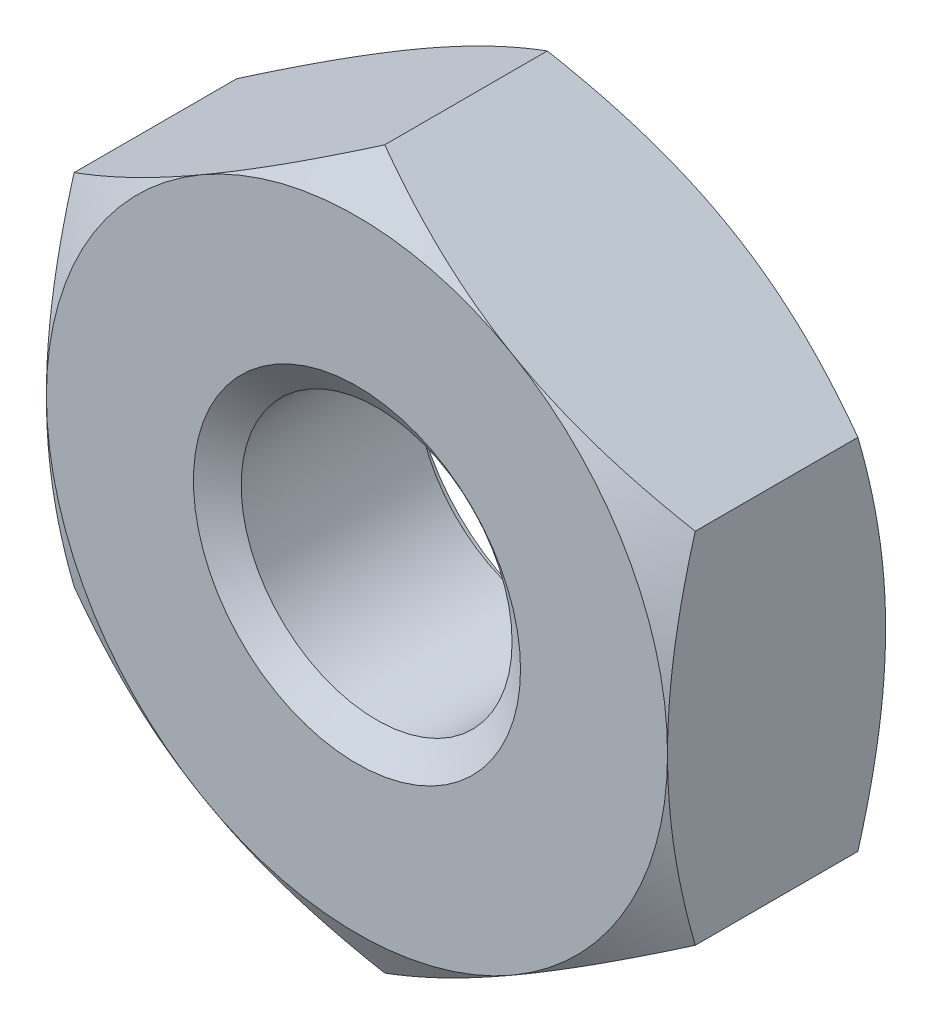
ISO-10303-21;
HEADER;
FILE_DESCRIPTION(('STEP AP214'),'2;1');
FILE_NAME('part.step','',(''),(''),'','','');
FILE_SCHEMA(('AUTOMOTIVE_DESIGN { 1 0 10303 214 1 1 1 1 }'));
ENDSEC;
DATA;
#1=APPLICATION_CONTEXT('core data for automotive mechanical design processes');
#2=APPLICATION_PROTOCOL_DEFINITION('international standard','automotive_design',2000,#1);
#3=PRODUCT_CONTEXT('',#1,'mechanical');
#4=PRODUCT('Part','Part','',(#3));
#5=PRODUCT_RELATED_PRODUCT_CATEGORY('part','',(#4));
#6=PRODUCT_DEFINITION_FORMATION('','',#4);
#7=PRODUCT_DEFINITION_CONTEXT('part definition',#1,'design');
#8=PRODUCT_DEFINITION('design','',#6,#7);
#9=PRODUCT_DEFINITION_SHAPE('','',#8);
#10=(LENGTH_UNIT() NAMED_UNIT(*) SI_UNIT(.MILLI.,.METRE.));
#11=(NAMED_UNIT(*) PLANE_ANGLE_UNIT() SI_UNIT($,.RADIAN.));
#12=(NAMED_UNIT(*) SI_UNIT($,.STERADIAN.) SOLID_ANGLE_UNIT());
#13=UNCERTAINTY_MEASURE_WITH_UNIT(LENGTH_MEASURE(1.E-05),#10,'distance_accuracy_value','');
#14=(GEOMETRIC_REPRESENTATION_CONTEXT(3) GLOBAL_UNCERTAINTY_ASSIGNED_CONTEXT((#13)) GLOBAL_UNIT_ASSIGNED_CONTEXT((#10,
#11,#12)) REPRESENTATION_CONTEXT('',''));
#15=CARTESIAN_POINT('',(0.,0.,0.));
#16=DIRECTION('',(0.,0.,1.));
#17=DIRECTION('',(1.,0.,0.));
#18=AXIS2_PLACEMENT_3D('',#15,#16,#17);
#19=CARTESIAN_POINT('',(0.,0.,-1.6764));
#20=DIRECTION('',(0.,0.,1.));
#21=DIRECTION('',(1.,0.,0.));
#22=AXIS2_PLACEMENT_3D('',#19,#20,#21);
#23=CYLINDRICAL_SURFACE('',#22,1.0414);
#24=CARTESIAN_POINT('',(0.,0.,-0.151174807499475));
#25=DIRECTION('',(0.,0.,1.));
#26=DIRECTION('',(1.,0.,0.));
#27=AXIS2_PLACEMENT_3D('',#24,#25,#26);
#28=CIRCLE('',#27,1.0414);
#29=CARTESIAN_POINT('',(1.0414,0.,-0.151174807499475));
#30=VERTEX_POINT('',#29);
#31=EDGE_CURVE('E174',#30,#30,#28,.F.);
#32=ORIENTED_EDGE('',*,*,#31,.F.);
#33=EDGE_LOOP('',(#32));
#34=FACE_BOUND('',#33,.T.);
#35=CARTESIAN_POINT('',(0.,0.,-1.49982519250052));
#36=DIRECTION('',(0.,0.,-1.));
#37=DIRECTION('',(-1.,0.,0.));
#38=AXIS2_PLACEMENT_3D('',#35,#36,#37);
#39=CIRCLE('',#38,1.0414);
#40=CARTESIAN_POINT('',(-1.0414,0.,-1.49982519250052));
#41=VERTEX_POINT('',#40);
#42=EDGE_CURVE('E39',#41,#41,#39,.F.);
#43=ORIENTED_EDGE('',*,*,#42,.F.);
#44=EDGE_LOOP('',(#43));
#45=FACE_BOUND('',#44,.T.);
#46=ADVANCED_FACE('F34',(#34,#45),#23,.F.);
#47=CARTESIAN_POINT('',(0.,2.7569630054343,-1.6764));
#48=DIRECTION('',(0.,0.,-1.));
#49=DIRECTION('',(-1.,0.,0.));
#50=AXIS2_PLACEMENT_3D('',#47,#48,#49);
#51=PLANE('',#50);
#52=CARTESIAN_POINT('',(0.,0.,-1.6764));
#53=DIRECTION('',(0.,0.,-1.));
#54=DIRECTION('',(-1.,0.,0.));
#55=AXIS2_PLACEMENT_3D('',#52,#53,#54);
#56=CIRCLE('',#55,2.3876);
#57=CARTESIAN_POINT('',(-2.3876,0.,-1.6764));
#58=VERTEX_POINT('',#57);
#59=CARTESIAN_POINT('',(-1.1938,-2.06772225407572,-1.6764));
#60=VERTEX_POINT('',#59);
#61=EDGE_CURVE('E170',#58,#60,#56,.F.);
#62=ORIENTED_EDGE('',*,*,#61,.F.);
#63=CARTESIAN_POINT('',(-1.1938,2.06772225407572,-1.6764));
#64=VERTEX_POINT('',#63);
#65=EDGE_CURVE('E152',#64,#58,#56,.F.);
#66=ORIENTED_EDGE('',*,*,#65,.F.);
#67=CARTESIAN_POINT('',(1.1938,2.06772225407572,-1.6764));
#68=VERTEX_POINT('',#67);
#69=EDGE_CURVE('E169',#68,#64,#56,.F.);
#70=ORIENTED_EDGE('',*,*,#69,.F.);
#71=CARTESIAN_POINT('',(0.,0.,-1.6764));
#72=DIRECTION('',(0.,0.,1.));
#73=DIRECTION('',(1.,0.,0.));
#74=AXIS2_PLACEMENT_3D('',#71,#72,#73);
#75=CIRCLE('',#74,2.3876);
#76=CARTESIAN_POINT('',(2.3876,0.,-1.6764));
#77=VERTEX_POINT('',#76);
#78=EDGE_CURVE('E244',#77,#68,#75,.T.);
#79=ORIENTED_EDGE('',*,*,#78,.F.);
#80=CARTESIAN_POINT('',(1.1938,-2.06772225407572,-1.6764));
#81=VERTEX_POINT('',#80);
#82=EDGE_CURVE('E360',#81,#77,#56,.F.);
#83=ORIENTED_EDGE('',*,*,#82,.F.);
#84=EDGE_CURVE('E364',#60,#81,#56,.F.);
#85=ORIENTED_EDGE('',*,*,#84,.F.);
#86=EDGE_LOOP('',(#62,#66,#70,#79,#83,#85));
#87=FACE_BOUND('',#86,.T.);
#88=CARTESIAN_POINT('',(0.,0.,-1.6764));
#89=DIRECTION('',(0.,0.,-1.));
#90=DIRECTION('',(-1.,0.,0.));
#91=AXIS2_PLACEMENT_3D('',#88,#89,#90);
#92=CIRCLE('',#91,1.2573);
#93=CARTESIAN_POINT('',(-1.2573,0.,-1.6764));
#94=VERTEX_POINT('',#93);
#95=EDGE_CURVE('E177',#94,#94,#92,.F.);
#96=ORIENTED_EDGE('',*,*,#95,.T.);
#97=EDGE_LOOP('',(#96));
#98=FACE_BOUND('',#97,.T.);
#99=ADVANCED_FACE('F297',(#87,#98),#51,.T.);
#100=CARTESIAN_POINT('',(0.,2.7569630054343,0.));
#101=DIRECTION('',(0.,0.,-1.));
#102=DIRECTION('',(-1.,0.,0.));
#103=AXIS2_PLACEMENT_3D('',#100,#101,#102);
#104=PLANE('',#103);
#105=CARTESIAN_POINT('',(0.,0.,0.));
#106=DIRECTION('',(0.,0.,-1.));
#107=DIRECTION('',(-1.,0.,0.));
#108=AXIS2_PLACEMENT_3D('',#105,#106,#107);
#109=CIRCLE('',#108,2.3876);
#110=CARTESIAN_POINT('',(-2.3876,0.,0.));
#111=VERTEX_POINT('',#110);
#112=CARTESIAN_POINT('',(-1.1938,2.06772225407572,0.));
#113=VERTEX_POINT('',#112);
#114=EDGE_CURVE('E11',#111,#113,#109,.T.);
#115=ORIENTED_EDGE('',*,*,#114,.F.);
#116=CARTESIAN_POINT('',(-1.1938,-2.06772225407572,0.));
#117=VERTEX_POINT('',#116);
#118=EDGE_CURVE('E46',#117,#111,#109,.T.);
#119=ORIENTED_EDGE('',*,*,#118,.F.);
#120=CARTESIAN_POINT('',(1.1938,-2.06772225407572,0.));
#121=VERTEX_POINT('',#120);
#122=EDGE_CURVE('E173',#121,#117,#109,.T.);
#123=ORIENTED_EDGE('',*,*,#122,.F.);
#124=CARTESIAN_POINT('',(2.3876,0.,0.));
#125=VERTEX_POINT('',#124);
#126=EDGE_CURVE('E351',#125,#121,#109,.T.);
#127=ORIENTED_EDGE('',*,*,#126,.F.);
#128=CARTESIAN_POINT('',(0.,0.,0.));
#129=DIRECTION('',(0.,0.,1.));
#130=DIRECTION('',(1.,0.,0.));
#131=AXIS2_PLACEMENT_3D('',#128,#129,#130);
#132=CIRCLE('',#131,2.3876);
#133=CARTESIAN_POINT('',(1.1938,2.06772225407572,0.));
#134=VERTEX_POINT('',#133);
#135=EDGE_CURVE('E128',#125,#134,#132,.T.);
#136=ORIENTED_EDGE('',*,*,#135,.T.);
#137=EDGE_CURVE('E44',#113,#134,#109,.T.);
#138=ORIENTED_EDGE('',*,*,#137,.F.);
#139=EDGE_LOOP('',(#115,#119,#123,#127,#136,#138));
#140=FACE_BOUND('',#139,.T.);
#141=CARTESIAN_POINT('',(0.,0.,0.));
#142=DIRECTION('',(0.,0.,1.));
#143=DIRECTION('',(1.,0.,0.));
#144=AXIS2_PLACEMENT_3D('',#141,#142,#143);
#145=CIRCLE('',#144,1.2573);
#146=CARTESIAN_POINT('',(1.2573,0.,0.));
#147=VERTEX_POINT('',#146);
#148=EDGE_CURVE('E176',#147,#147,#145,.T.);
#149=ORIENTED_EDGE('',*,*,#148,.F.);
#150=EDGE_LOOP('',(#149));
#151=FACE_BOUND('',#150,.T.);
#152=ADVANCED_FACE('F249',(#140,#151),#104,.F.);
#153=CARTESIAN_POINT('',(0.,2.7569630054343,-1.6764));
#154=DIRECTION('',(-0.500000000000002,0.866025403784437,0.));
#155=DIRECTION('',(-0.866025403784437,-0.500000000000002,0.));
#156=AXIS2_PLACEMENT_3D('',#153,#154,#155);
#157=PLANE('',#156);
#158=DIRECTION('',(0.,0.,1.));
#159=VECTOR('',#158,1.);
#160=CARTESIAN_POINT('',(-2.3876,1.37848150271715,-1.6764));
#161=LINE('',#160,#159);
#162=CARTESIAN_POINT('',(-2.3876,1.37848150271716,-1.46314816938381));
#163=VERTEX_POINT('',#162);
#164=CARTESIAN_POINT('',(-2.3876,1.37848150271715,-0.213251830616182));
#165=VERTEX_POINT('',#164);
#166=EDGE_CURVE('E164',#163,#165,#161,.T.);
#167=ORIENTED_EDGE('',*,*,#166,.T.);
#168=CARTESIAN_POINT('',(-2.3878,1.37836603266331,-0.21331850147098));
#169=CARTESIAN_POINT('',(-2.28287606453564,1.43894389504809,-0.178329367585889));
#170=CARTESIAN_POINT('',(-2.17704643460647,1.50004466037594,-0.14650774522937));
#171=CARTESIAN_POINT('',(-1.96355453037943,1.62330426875122,-0.090962139707539));
#172=CARTESIAN_POINT('',(-1.85588846194031,1.68546530234714,-0.0672578076475629));
#173=CARTESIAN_POINT('',(-1.64189067804026,1.80901698048782,-0.0303576796709488));
#174=CARTESIAN_POINT('',(-1.53559189340191,1.8703886124133,-0.0169163088441161));
#175=CARTESIAN_POINT('',(-1.32249401746024,1.99342072845196,-0.000868578218159202));
#176=CARTESIAN_POINT('',(-1.21569570098293,2.05508076521913,0.00175106886924191));
#177=CARTESIAN_POINT('',(-1.01612814269019,2.17030114872096,-0.00369159153788397));
#178=CARTESIAN_POINT('',(-0.923329063406966,2.22387872212568,-0.0104175391417703));
#179=CARTESIAN_POINT('',(-0.738335505406027,2.33068480263587,-0.0317370557583216));
#180=CARTESIAN_POINT('',(-0.646141666797155,2.38391294017433,-0.0463379112564593));
#181=CARTESIAN_POINT('',(-0.460766524191893,2.49093932865855,-0.0828397901525205));
#182=CARTESIAN_POINT('',(-0.367608688702191,2.54472403005565,-0.104895581600361));
#183=CARTESIAN_POINT('',(-0.182682641216107,2.65149113335191,-0.154953888652164));
#184=CARTESIAN_POINT('',(-0.090912059069754,2.7044749036578,-0.182944638241837));
#185=CARTESIAN_POINT('',(0.000199999999999888,2.75707847548814,-0.213318501470982));
#186=B_SPLINE_CURVE_WITH_KNOTS('',3,(#168,#169,#170,#171,#172,#173,#174,#175,#176,#177,#178,
#179,#180,#181,#182,#183,#184,#185),.UNSPECIFIED.,.F.,.F.,(4,2,2,2,2,2,2,2,4),(0.,
0.378469527554648,0.757848917720109,1.12783830118146,1.49737326355505,1.81916504067612,
2.14125507699892,2.47049068028368,2.79907957904288),.UNSPECIFIED.);
#187=EDGE_CURVE('E133',#165,#113,#186,.T.);
#188=ORIENTED_EDGE('',*,*,#187,.T.);
#189=CARTESIAN_POINT('',(0.,2.7569630054343,-0.213251830616185));
#190=VERTEX_POINT('',#189);
#191=EDGE_CURVE('E53',#113,#190,#186,.T.);
#192=ORIENTED_EDGE('',*,*,#191,.T.);
#193=DIRECTION('',(0.,0.,1.));
#194=VECTOR('',#193,1.);
#195=CARTESIAN_POINT('',(0.,2.7569630054343,-1.6764));
#196=LINE('',#195,#194);
#197=CARTESIAN_POINT('',(0.,2.7569630054343,-1.46314816938381));
#198=VERTEX_POINT('',#197);
#199=EDGE_CURVE('E149',#198,#190,#196,.T.);
#200=ORIENTED_EDGE('',*,*,#199,.F.);
#201=CARTESIAN_POINT('',(-2.3878,1.37836603266331,-1.46308149852902));
#202=CARTESIAN_POINT('',(-2.28287606453564,1.43894389504809,-1.49807063241411));
#203=CARTESIAN_POINT('',(-2.17704643460647,1.50004466037594,-1.52989225477063));
#204=CARTESIAN_POINT('',(-1.96355453037943,1.62330426875122,-1.58543786029246));
#205=CARTESIAN_POINT('',(-1.85588846194031,1.68546530234714,-1.60914219235244));
#206=CARTESIAN_POINT('',(-1.64189067804026,1.80901698048782,-1.64604232032905));
#207=CARTESIAN_POINT('',(-1.53559189340191,1.8703886124133,-1.65948369115588));
#208=CARTESIAN_POINT('',(-1.32249401746024,1.99342072845196,-1.67553142178184));
#209=CARTESIAN_POINT('',(-1.21569570098293,2.05508076521913,-1.67815106886924));
#210=CARTESIAN_POINT('',(-1.01612814269019,2.17030114872096,-1.67270840846212));
#211=CARTESIAN_POINT('',(-0.923329063406966,2.22387872212568,-1.66598246085823));
#212=CARTESIAN_POINT('',(-0.738335505406027,2.33068480263587,-1.64466294424168));
#213=CARTESIAN_POINT('',(-0.646141666797155,2.38391294017433,-1.63006208874354));
#214=CARTESIAN_POINT('',(-0.460766524191893,2.49093932865855,-1.59356020984748));
#215=CARTESIAN_POINT('',(-0.367608688702191,2.54472403005565,-1.57150441839964));
#216=CARTESIAN_POINT('',(-0.182682641216107,2.65149113335191,-1.52144611134784));
#217=CARTESIAN_POINT('',(-0.0909120590697541,2.7044749036578,-1.49345536175816));
#218=CARTESIAN_POINT('',(0.000199999999999884,2.75707847548814,-1.46308149852902));
#219=B_SPLINE_CURVE_WITH_KNOTS('',3,(#201,#202,#203,#204,#205,#206,#207,#208,#209,#210,#211,
#212,#213,#214,#215,#216,#217,#218),.UNSPECIFIED.,.F.,.F.,(4,2,2,2,2,2,2,2,4),(0.,
0.378469527554648,0.757848917720109,1.12783830118146,1.49737326355505,1.81916504067612,
2.14125507699892,2.47049068028368,2.79907957904288),.UNSPECIFIED.);
#220=EDGE_CURVE('E167',#64,#198,#219,.T.);
#221=ORIENTED_EDGE('',*,*,#220,.F.);
#222=EDGE_CURVE('E259',#163,#64,#219,.T.);
#223=ORIENTED_EDGE('',*,*,#222,.F.);
#224=EDGE_LOOP('',(#167,#188,#192,#200,#221,#223));
#225=FACE_BOUND('',#224,.T.);
#226=ADVANCED_FACE('F36',(#225),#157,.T.);
#227=CARTESIAN_POINT('',(2.3876,1.37848150271715,-1.6764));
#228=DIRECTION('',(0.500000000000001,0.866025403784438,0.));
#229=DIRECTION('',(-0.866025403784438,0.500000000000001,0.));
#230=AXIS2_PLACEMENT_3D('',#227,#228,#229);
#231=PLANE('',#230);
#232=ORIENTED_EDGE('',*,*,#199,.T.);
#233=CARTESIAN_POINT('',(-0.000200000000000363,2.75707847548814,-0.213318501470983));
#234=CARTESIAN_POINT('',(0.104723935464364,2.69650061310336,-0.178329367585892));
#235=CARTESIAN_POINT('',(0.210553565393532,2.63539984777551,-0.146507745229373));
#236=CARTESIAN_POINT('',(0.424045469620569,2.51214023940023,-0.0909621397075412));
#237=CARTESIAN_POINT('',(0.531711538059696,2.44997920580431,-0.0672578076475647));
#238=CARTESIAN_POINT('',(0.745709321959739,2.32642752766363,-0.03035767967095));
#239=CARTESIAN_POINT('',(0.852008106598096,2.26505589573815,-0.0169163088441171));
#240=CARTESIAN_POINT('',(1.06510598253976,2.14202377969949,-0.000868578218159741));
#241=CARTESIAN_POINT('',(1.17190429901707,2.08036374293232,0.00175106886924156));
#242=CARTESIAN_POINT('',(1.37147185730981,1.96514335943049,-0.00369159153788401));
#243=CARTESIAN_POINT('',(1.46427093659304,1.91156578602577,-0.0104175391417701));
#244=CARTESIAN_POINT('',(1.64926449459397,1.80475970551558,-0.0317370557583211));
#245=CARTESIAN_POINT('',(1.74145833320285,1.75153156797712,-0.0463379112564585));
#246=CARTESIAN_POINT('',(1.92683347580811,1.64450517949291,-0.0828397901525192));
#247=CARTESIAN_POINT('',(2.01999131129781,1.5907204780958,-0.10489558160036));
#248=CARTESIAN_POINT('',(2.20491735878389,1.48395337479954,-0.154953888652162));
#249=CARTESIAN_POINT('',(2.29668794093025,1.43096960449365,-0.182944638241835));
#250=CARTESIAN_POINT('',(2.3878,1.37836603266331,-0.21331850147098));
#251=B_SPLINE_CURVE_WITH_KNOTS('',3,(#233,#234,#235,#236,#237,#238,#239,#240,#241,#242,#243,
#244,#245,#246,#247,#248,#249,#250),.UNSPECIFIED.,.F.,.F.,(4,2,2,2,2,2,2,2,4),(0.,
0.378469527554649,0.75784891772011,1.12783830118146,1.49737326355505,1.81916504067612,
2.14125507699893,2.47049068028368,2.79907957904288),.UNSPECIFIED.);
#252=EDGE_CURVE('E143',#190,#134,#251,.T.);
#253=ORIENTED_EDGE('',*,*,#252,.T.);
#254=CARTESIAN_POINT('',(2.3876,1.37848150271716,-0.213251830616185));
#255=VERTEX_POINT('',#254);
#256=EDGE_CURVE('E60',#134,#255,#251,.T.);
#257=ORIENTED_EDGE('',*,*,#256,.T.);
#258=DIRECTION('',(0.,0.,1.));
#259=VECTOR('',#258,1.);
#260=CARTESIAN_POINT('',(2.3876,1.37848150271715,-1.6764));
#261=LINE('',#260,#259);
#262=CARTESIAN_POINT('',(2.3876,1.37848150271716,-1.46314816938381));
#263=VERTEX_POINT('',#262);
#264=EDGE_CURVE('E142',#263,#255,#261,.T.);
#265=ORIENTED_EDGE('',*,*,#264,.F.);
#266=CARTESIAN_POINT('',(-0.00020000000000037,2.75707847548814,-1.46308149852902));
#267=CARTESIAN_POINT('',(0.104723935464363,2.69650061310336,-1.49807063241411));
#268=CARTESIAN_POINT('',(0.210553565393531,2.63539984777551,-1.52989225477063));
#269=CARTESIAN_POINT('',(0.424045469620569,2.51214023940023,-1.58543786029246));
#270=CARTESIAN_POINT('',(0.531711538059695,2.44997920580431,-1.60914219235244));
#271=CARTESIAN_POINT('',(0.745709321959739,2.32642752766363,-1.64604232032905));
#272=CARTESIAN_POINT('',(0.852008106598096,2.26505589573815,-1.65948369115588));
#273=CARTESIAN_POINT('',(1.06510598253976,2.14202377969949,-1.67553142178184));
#274=CARTESIAN_POINT('',(1.17190429901707,2.08036374293232,-1.67815106886924));
#275=CARTESIAN_POINT('',(1.37147185730981,1.96514335943049,-1.67270840846212));
#276=CARTESIAN_POINT('',(1.46427093659304,1.91156578602577,-1.66598246085823));
#277=CARTESIAN_POINT('',(1.64926449459397,1.80475970551558,-1.64466294424168));
#278=CARTESIAN_POINT('',(1.74145833320285,1.75153156797712,-1.63006208874354));
#279=CARTESIAN_POINT('',(1.92683347580811,1.64450517949291,-1.59356020984748));
#280=CARTESIAN_POINT('',(2.01999131129781,1.5907204780958,-1.57150441839964));
#281=CARTESIAN_POINT('',(2.20491735878389,1.48395337479954,-1.52144611134784));
#282=CARTESIAN_POINT('',(2.29668794093025,1.43096960449365,-1.49345536175817));
#283=CARTESIAN_POINT('',(2.3878,1.37836603266331,-1.46308149852902));
#284=B_SPLINE_CURVE_WITH_KNOTS('',3,(#266,#267,#268,#269,#270,#271,#272,#273,#274,#275,#276,
#277,#278,#279,#280,#281,#282,#283),.UNSPECIFIED.,.F.,.F.,(4,2,2,2,2,2,2,2,4),(0.,
0.378469527554649,0.75784891772011,1.12783830118146,1.49737326355505,1.81916504067612,
2.14125507699893,2.47049068028368,2.79907957904288),.UNSPECIFIED.);
#285=EDGE_CURVE('E253',#68,#263,#284,.T.);
#286=ORIENTED_EDGE('',*,*,#285,.F.);
#287=EDGE_CURVE('E258',#198,#68,#284,.T.);
#288=ORIENTED_EDGE('',*,*,#287,.F.);
#289=EDGE_LOOP('',(#232,#253,#257,#265,#286,#288));
#290=FACE_BOUND('',#289,.T.);
#291=ADVANCED_FACE('F140',(#290),#231,.T.);
#292=CARTESIAN_POINT('',(2.3876,1.37848150271715,-1.6764));
#293=DIRECTION('',(-1.,0.,0.));
#294=DIRECTION('',(0.,0.,1.));
#295=AXIS2_PLACEMENT_3D('',#292,#293,#294);
#296=PLANE('',#295);
#297=CARTESIAN_POINT('',(2.3876,-3.65593609080648,-1.14253036159854));
#298=CARTESIAN_POINT('',(2.3876,-3.55110694918386,-1.09187113002076));
#299=CARTESIAN_POINT('',(2.3876,-3.44602995685676,-1.04171549313264));
#300=CARTESIAN_POINT('',(2.3876,-3.23524625803961,-0.942699180123228));
#301=CARTESIAN_POINT('',(2.3876,-3.12953944635139,-0.893838728210001));
#302=CARTESIAN_POINT('',(2.3876,-2.91679107639573,-0.797443156999653));
#303=CARTESIAN_POINT('',(2.3876,-2.8097453416106,-0.749917222133128));
#304=CARTESIAN_POINT('',(2.3876,-2.59477405010642,-0.656906706437376));
#305=CARTESIAN_POINT('',(2.3876,-2.48684853959578,-0.611422019201738));
#306=CARTESIAN_POINT('',(2.3876,-2.26860623456077,-0.522496803220395));
#307=CARTESIAN_POINT('',(2.3876,-2.15827634925911,-0.479088225948439));
#308=CARTESIAN_POINT('',(2.3876,-1.93631522811917,-0.395670822259678));
#309=CARTESIAN_POINT('',(2.3876,-1.82468384906324,-0.355662374089447));
#310=CARTESIAN_POINT('',(2.3876,-1.60017141965676,-0.280120244638394));
#311=CARTESIAN_POINT('',(2.3876,-1.48729360332199,-0.244577050022473));
#312=CARTESIAN_POINT('',(2.3876,-1.2599332647214,-0.179119755521416));
#313=CARTESIAN_POINT('',(2.3876,-1.14545126227174,-0.149203875516054));
#314=CARTESIAN_POINT('',(2.3876,-0.914804359975557,-0.0964535455080678));
#315=CARTESIAN_POINT('',(2.3876,-0.798639020636918,-0.0736209810274591));
#316=CARTESIAN_POINT('',(2.3876,-0.564907787073329,-0.0365745914220469));
#317=CARTESIAN_POINT('',(2.3876,-0.447341891610204,-0.0223607739172991));
#318=CARTESIAN_POINT('',(2.3876,-0.21216929260892,-0.00380930426889846));
#319=CARTESIAN_POINT('',(2.3876,-0.0945676495920168,0.000590871764265564));
#320=CARTESIAN_POINT('',(2.3876,0.140553287899096,-0.000718707219115579));
#321=CARTESIAN_POINT('',(2.3876,0.258072595825754,-0.00642583790168291));
#322=CARTESIAN_POINT('',(2.3876,0.458753843166109,-0.0244005166908523));
#323=CARTESIAN_POINT('',(2.3876,0.542137181712106,-0.0343272988086097));
#324=CARTESIAN_POINT('',(2.3876,0.708259747560013,-0.0586235846359403));
#325=CARTESIAN_POINT('',(2.3876,0.790998871167446,-0.0729937890101866));
#326=CARTESIAN_POINT('',(2.3876,1.03818247230877,-0.122015355850193));
#327=CARTESIAN_POINT('',(2.3876,1.20146831776594,-0.162565050307174));
#328=CARTESIAN_POINT('',(2.3876,1.44580075224369,-0.232502314876439));
#329=CARTESIAN_POINT('',(2.3876,1.52812092254202,-0.257690051867366));
#330=CARTESIAN_POINT('',(2.3876,1.69190206167628,-0.310557865937952));
#331=CARTESIAN_POINT('',(2.3876,1.77336358043201,-0.338236223967968));
#332=CARTESIAN_POINT('',(2.3876,1.93508677044204,-0.395509341840713));
#333=CARTESIAN_POINT('',(2.3876,2.01535261438468,-0.425092437982265));
#334=CARTESIAN_POINT('',(2.3876,2.17526154662174,-0.485994997377671));
#335=CARTESIAN_POINT('',(2.3876,2.2549043681669,-0.517315162412036));
#336=CARTESIAN_POINT('',(2.3876,2.33425921925152,-0.549332446004797));
#337=B_SPLINE_CURVE_WITH_KNOTS('',3,(#297,#298,#299,#300,#301,#302,#303,#304,#305,#306,#307,
#308,#309,#310,#311,#312,#313,#314,#315,#316,#317,#318,#319,#320,#321,#322,#323,#324,#325,#326,
#327,#328,#329,#330,#331,#332,#333,#334,#335,#336),.UNSPECIFIED.,.F.,.F.,(4,2,2,2,2,2,2,2,2,2,2,
2,2,2,2,2,2,2,2,4),(0.,0.349289042962512,0.698638161244703,1.04998646344191,1.40131642918613,
1.75695963655398,2.1126423557206,2.46755394737998,2.82235307834569,3.17724657312797,
3.53214038168024,3.88476658086275,4.23730123505986,4.48909473258754,4.74092795464398,
5.24496920192683,5.50321076764731,5.76127544014718,6.01788755129247,6.27460410049569),.UNSPECIFIED.);
#338=CARTESIAN_POINT('',(2.3876,-1.37848150271716,-0.213251830616185));
#339=VERTEX_POINT('',#338);
#340=EDGE_CURVE('E135',#339,#125,#337,.T.);
#341=ORIENTED_EDGE('',*,*,#340,.F.);
#342=DIRECTION('',(0.,0.,1.));
#343=VECTOR('',#342,1.);
#344=CARTESIAN_POINT('',(2.3876,-1.37848150271716,-1.6764));
#345=LINE('',#344,#343);
#346=CARTESIAN_POINT('',(2.3876,-1.37848150271716,-1.46314816938381));
#347=VERTEX_POINT('',#346);
#348=EDGE_CURVE('E150',#347,#339,#345,.T.);
#349=ORIENTED_EDGE('',*,*,#348,.F.);
#350=CARTESIAN_POINT('',(2.3876,-3.65593609080648,-0.533869638401461));
#351=CARTESIAN_POINT('',(2.3876,-3.55110694918386,-0.584528869979237));
#352=CARTESIAN_POINT('',(2.3876,-3.44602995685676,-0.634684506867363));
#353=CARTESIAN_POINT('',(2.3876,-3.23524625803961,-0.733700819876772));
#354=CARTESIAN_POINT('',(2.3876,-3.12953944635139,-0.782561271789999));
#355=CARTESIAN_POINT('',(2.3876,-2.91679107639573,-0.878956843000347));
#356=CARTESIAN_POINT('',(2.3876,-2.8097453416106,-0.926482777866872));
#357=CARTESIAN_POINT('',(2.3876,-2.59477405010642,-1.01949329356262));
#358=CARTESIAN_POINT('',(2.3876,-2.48684853959578,-1.06497798079826));
#359=CARTESIAN_POINT('',(2.3876,-2.26860623456077,-1.1539031967796));
#360=CARTESIAN_POINT('',(2.3876,-2.15827634925911,-1.19731177405156));
#361=CARTESIAN_POINT('',(2.3876,-1.93631522811917,-1.28072917774032));
#362=CARTESIAN_POINT('',(2.3876,-1.82468384906324,-1.32073762591055));
#363=CARTESIAN_POINT('',(2.3876,-1.60017141965676,-1.39627975536161));
#364=CARTESIAN_POINT('',(2.3876,-1.48729360332199,-1.43182294997753));
#365=CARTESIAN_POINT('',(2.3876,-1.2599332647214,-1.49728024447858));
#366=CARTESIAN_POINT('',(2.3876,-1.14545126227174,-1.52719612448395));
#367=CARTESIAN_POINT('',(2.3876,-0.914804359975557,-1.57994645449193));
#368=CARTESIAN_POINT('',(2.3876,-0.798639020636918,-1.60277901897254));
#369=CARTESIAN_POINT('',(2.3876,-0.564907787073329,-1.63982540857795));
#370=CARTESIAN_POINT('',(2.3876,-0.447341891610205,-1.6540392260827));
#371=CARTESIAN_POINT('',(2.3876,-0.21216929260892,-1.6725906957311));
#372=CARTESIAN_POINT('',(2.3876,-0.0945676495920169,-1.67699087176427));
#373=CARTESIAN_POINT('',(2.3876,0.140553287899096,-1.67568129278088));
#374=CARTESIAN_POINT('',(2.3876,0.258072595825753,-1.66997416209832));
#375=CARTESIAN_POINT('',(2.3876,0.458753843166109,-1.65199948330915));
#376=CARTESIAN_POINT('',(2.3876,0.542137181712106,-1.64207270119139));
#377=CARTESIAN_POINT('',(2.3876,0.708259747560014,-1.61777641536406));
#378=CARTESIAN_POINT('',(2.3876,0.790998871167447,-1.60340621098981));
#379=CARTESIAN_POINT('',(2.3876,1.03818247230877,-1.55438464414981));
#380=CARTESIAN_POINT('',(2.3876,1.20146831776594,-1.51383494969283));
#381=CARTESIAN_POINT('',(2.3876,1.44580075224369,-1.44389768512356));
#382=CARTESIAN_POINT('',(2.3876,1.52812092254202,-1.41870994813263));
#383=CARTESIAN_POINT('',(2.3876,1.69190206167628,-1.36584213406205));
#384=CARTESIAN_POINT('',(2.3876,1.77336358043201,-1.33816377603203));
#385=CARTESIAN_POINT('',(2.3876,1.93508677044204,-1.28089065815929));
#386=CARTESIAN_POINT('',(2.3876,2.01535261438468,-1.25130756201773));
#387=CARTESIAN_POINT('',(2.3876,2.17526154662174,-1.19040500262233));
#388=CARTESIAN_POINT('',(2.3876,2.2549043681669,-1.15908483758796));
#389=CARTESIAN_POINT('',(2.3876,2.33425921925152,-1.1270675539952));
#390=B_SPLINE_CURVE_WITH_KNOTS('',3,(#350,#351,#352,#353,#354,#355,#356,#357,#358,#359,#360,
#361,#362,#363,#364,#365,#366,#367,#368,#369,#370,#371,#372,#373,#374,#375,#376,#377,#378,#379,
#380,#381,#382,#383,#384,#385,#386,#387,#388,#389),.UNSPECIFIED.,.F.,.F.,(4,2,2,2,2,2,2,2,2,2,2,
2,2,2,2,2,2,2,2,4),(0.,0.349289042962512,0.698638161244703,1.04998646344191,1.40131642918613,
1.75695963655398,2.1126423557206,2.46755394737998,2.82235307834569,3.17724657312797,
3.53214038168024,3.88476658086274,4.23730123505986,4.48909473258754,4.74092795464398,
5.24496920192683,5.50321076764731,5.76127544014718,6.01788755129247,6.27460410049569),.UNSPECIFIED.);
#391=EDGE_CURVE('E265',#347,#77,#390,.T.);
#392=ORIENTED_EDGE('',*,*,#391,.T.);
#393=EDGE_CURVE('E148',#77,#263,#390,.T.);
#394=ORIENTED_EDGE('',*,*,#393,.T.);
#395=ORIENTED_EDGE('',*,*,#264,.T.);
#396=EDGE_CURVE('E125',#125,#255,#337,.T.);
#397=ORIENTED_EDGE('',*,*,#396,.F.);
#398=EDGE_LOOP('',(#341,#349,#392,#394,#395,#397));
#399=FACE_BOUND('',#398,.T.);
#400=ADVANCED_FACE('F146',(#399),#296,.F.);
#401=CARTESIAN_POINT('',(0.,-2.75696300543431,-1.6764));
#402=DIRECTION('',(0.500000000000002,-0.866025403784438,0.));
#403=DIRECTION('',(0.866025403784438,0.500000000000002,0.));
#404=AXIS2_PLACEMENT_3D('',#401,#402,#403);
#405=PLANE('',#404);
#406=ORIENTED_EDGE('',*,*,#348,.T.);
#407=CARTESIAN_POINT('',(2.3878,-1.37836603266332,-0.213318501470982));
#408=CARTESIAN_POINT('',(2.28287606453564,-1.4389438950481,-0.178329367585891));
#409=CARTESIAN_POINT('',(2.17704643460647,-1.50004466037595,-0.146507745229373));
#410=CARTESIAN_POINT('',(1.96355453037943,-1.62330426875123,-0.0909621397075419));
#411=CARTESIAN_POINT('',(1.8558884619403,-1.68546530234715,-0.067257807647566));
#412=CARTESIAN_POINT('',(1.64189067804026,-1.80901698048783,-0.0303576796709522));
#413=CARTESIAN_POINT('',(1.5355918934019,-1.87038861241331,-0.0169163088441197));
#414=CARTESIAN_POINT('',(1.32249401746024,-1.99342072845197,-0.000868578218163001));
#415=CARTESIAN_POINT('',(1.21569570098293,-2.05508076521914,0.00175106886923806));
#416=CARTESIAN_POINT('',(1.01612814269019,-2.17030114872097,-0.00369159153788822));
#417=CARTESIAN_POINT('',(0.923329063406964,-2.22387872212569,-0.0104175391417748));
#418=CARTESIAN_POINT('',(0.738335505406026,-2.33068480263588,-0.0317370557583263));
#419=CARTESIAN_POINT('',(0.646141666797153,-2.38391294017434,-0.0463379112564638));
#420=CARTESIAN_POINT('',(0.460766524191892,-2.49093932865855,-0.0828397901525249));
#421=CARTESIAN_POINT('',(0.36760868870219,-2.54472403005566,-0.104895581600366));
#422=CARTESIAN_POINT('',(0.182682641216107,-2.65149113335192,-0.154953888652168));
#423=CARTESIAN_POINT('',(0.0909120590697542,-2.70447490365781,-0.182944638241841));
#424=CARTESIAN_POINT('',(-0.000199999999999525,-2.75707847548815,-0.213318501470986));
#425=B_SPLINE_CURVE_WITH_KNOTS('',3,(#407,#408,#409,#410,#411,#412,#413,#414,#415,#416,#417,
#418,#419,#420,#421,#422,#423,#424),.UNSPECIFIED.,.F.,.F.,(4,2,2,2,2,2,2,2,4),(0.,
0.378469527554649,0.75784891772011,1.12783830118146,1.49737326355505,1.81916504067612,
2.14125507699893,2.47049068028368,2.79907957904288),.UNSPECIFIED.);
#426=EDGE_CURVE('E346',#339,#121,#425,.T.);
#427=ORIENTED_EDGE('',*,*,#426,.T.);
#428=CARTESIAN_POINT('',(0.,-2.7569630054343,-0.213251830616185));
#429=VERTEX_POINT('',#428);
#430=EDGE_CURVE('E225',#121,#429,#425,.T.);
#431=ORIENTED_EDGE('',*,*,#430,.T.);
#432=DIRECTION('',(0.,0.,1.));
#433=VECTOR('',#432,1.);
#434=CARTESIAN_POINT('',(0.,-2.75696300543431,-1.6764));
#435=LINE('',#434,#433);
#436=CARTESIAN_POINT('',(0.,-2.7569630054343,-1.46314816938381));
#437=VERTEX_POINT('',#436);
#438=EDGE_CURVE('E155',#437,#429,#435,.T.);
#439=ORIENTED_EDGE('',*,*,#438,.F.);
#440=CARTESIAN_POINT('',(2.3878,-1.37836603266332,-1.46308149852902));
#441=CARTESIAN_POINT('',(2.28287606453564,-1.4389438950481,-1.49807063241411));
#442=CARTESIAN_POINT('',(2.17704643460647,-1.50004466037595,-1.52989225477063));
#443=CARTESIAN_POINT('',(1.96355453037943,-1.62330426875123,-1.58543786029246));
#444=CARTESIAN_POINT('',(1.8558884619403,-1.68546530234715,-1.60914219235243));
#445=CARTESIAN_POINT('',(1.64189067804026,-1.80901698048783,-1.64604232032905));
#446=CARTESIAN_POINT('',(1.5355918934019,-1.87038861241331,-1.65948369115588));
#447=CARTESIAN_POINT('',(1.32249401746024,-1.99342072845197,-1.67553142178184));
#448=CARTESIAN_POINT('',(1.21569570098293,-2.05508076521914,-1.67815106886924));
#449=CARTESIAN_POINT('',(1.01612814269019,-2.17030114872097,-1.67270840846211));
#450=CARTESIAN_POINT('',(0.923329063406964,-2.22387872212569,-1.66598246085823));
#451=CARTESIAN_POINT('',(0.738335505406026,-2.33068480263588,-1.64466294424167));
#452=CARTESIAN_POINT('',(0.646141666797153,-2.38391294017434,-1.63006208874354));
#453=CARTESIAN_POINT('',(0.460766524191892,-2.49093932865855,-1.59356020984748));
#454=CARTESIAN_POINT('',(0.367608688702191,-2.54472403005566,-1.57150441839963));
#455=CARTESIAN_POINT('',(0.182682641216107,-2.65149113335192,-1.52144611134783));
#456=CARTESIAN_POINT('',(0.0909120590697542,-2.70447490365781,-1.49345536175816));
#457=CARTESIAN_POINT('',(-0.000199999999999526,-2.75707847548815,-1.46308149852901));
#458=B_SPLINE_CURVE_WITH_KNOTS('',3,(#440,#441,#442,#443,#444,#445,#446,#447,#448,#449,#450,
#451,#452,#453,#454,#455,#456,#457),.UNSPECIFIED.,.F.,.F.,(4,2,2,2,2,2,2,2,4),(0.,
0.378469527554649,0.75784891772011,1.12783830118146,1.49737326355505,1.81916504067612,
2.14125507699893,2.47049068028368,2.79907957904288),.UNSPECIFIED.);
#459=EDGE_CURVE('E271',#81,#437,#458,.T.);
#460=ORIENTED_EDGE('',*,*,#459,.F.);
#461=EDGE_CURVE('E270',#347,#81,#458,.T.);
#462=ORIENTED_EDGE('',*,*,#461,.F.);
#463=EDGE_LOOP('',(#406,#427,#431,#439,#460,#462));
#464=FACE_BOUND('',#463,.T.);
#465=ADVANCED_FACE('F281',(#464),#405,.T.);
#466=CARTESIAN_POINT('',(-2.3876,-1.37848150271716,-1.6764));
#467=DIRECTION('',(-0.500000000000001,-0.866025403784438,0.));
#468=DIRECTION('',(0.866025403784438,-0.500000000000001,0.));
#469=AXIS2_PLACEMENT_3D('',#466,#467,#468);
#470=PLANE('',#469);
#471=ORIENTED_EDGE('',*,*,#438,.T.);
#472=CARTESIAN_POINT('',(0.000200000000000626,-2.75707847548815,-0.213318501470987));
#473=CARTESIAN_POINT('',(-0.104723935464363,-2.69650061310336,-0.178329367585896));
#474=CARTESIAN_POINT('',(-0.210553565393532,-2.63539984777552,-0.146507745229377));
#475=CARTESIAN_POINT('',(-0.42404546962057,-2.51214023940023,-0.090962139707545));
#476=CARTESIAN_POINT('',(-0.531711538059697,-2.44997920580431,-0.0672578076475685));
#477=CARTESIAN_POINT('',(-0.745709321959741,-2.32642752766364,-0.0303576796709539));
#478=CARTESIAN_POINT('',(-0.852008106598098,-2.26505589573815,-0.0169163088441211));
#479=CARTESIAN_POINT('',(-1.06510598253976,-2.1420237796995,-0.000868578218163866));
#480=CARTESIAN_POINT('',(-1.17190429901707,-2.08036374293232,0.00175106886923747));
#481=CARTESIAN_POINT('',(-1.37147185730981,-1.96514335943049,-0.00369159153788817));
#482=CARTESIAN_POINT('',(-1.46427093659304,-1.91156578602577,-0.0104175391417743));
#483=CARTESIAN_POINT('',(-1.64926449459398,-1.80475970551558,-0.031737055758325));
#484=CARTESIAN_POINT('',(-1.74145833320285,-1.75153156797713,-0.0463379112564622));
#485=CARTESIAN_POINT('',(-1.92683347580811,-1.64450517949291,-0.0828397901525225));
#486=CARTESIAN_POINT('',(-2.01999131129781,-1.59072047809581,-0.104895581600363));
#487=CARTESIAN_POINT('',(-2.20491735878389,-1.48395337479955,-0.154953888652165));
#488=CARTESIAN_POINT('',(-2.29668794093025,-1.43096960449366,-0.182944638241837));
#489=CARTESIAN_POINT('',(-2.3878,-1.37836603266332,-0.213318501470982));
#490=B_SPLINE_CURVE_WITH_KNOTS('',3,(#472,#473,#474,#475,#476,#477,#478,#479,#480,#481,#482,
#483,#484,#485,#486,#487,#488,#489),.UNSPECIFIED.,.F.,.F.,(4,2,2,2,2,2,2,2,4),(0.,
0.37846952755465,0.757848917720113,1.12783830118147,1.49737326355506,1.81916504067612,
2.14125507699893,2.47049068028368,2.79907957904288),.UNSPECIFIED.);
#491=EDGE_CURVE('E344',#429,#117,#490,.T.);
#492=ORIENTED_EDGE('',*,*,#491,.T.);
#493=CARTESIAN_POINT('',(-2.3876,-1.37848150271716,-0.213251830616185));
#494=VERTEX_POINT('',#493);
#495=EDGE_CURVE('E199',#117,#494,#490,.T.);
#496=ORIENTED_EDGE('',*,*,#495,.T.);
#497=DIRECTION('',(0.,0.,1.));
#498=VECTOR('',#497,1.);
#499=CARTESIAN_POINT('',(-2.3876,-1.37848150271716,-1.6764));
#500=LINE('',#499,#498);
#501=CARTESIAN_POINT('',(-2.3876,-1.37848150271716,-1.46314816938381));
#502=VERTEX_POINT('',#501);
#503=EDGE_CURVE('E161',#502,#494,#500,.T.);
#504=ORIENTED_EDGE('',*,*,#503,.F.);
#505=CARTESIAN_POINT('',(0.000200000000000626,-2.75707847548815,-1.46308149852901));
#506=CARTESIAN_POINT('',(-0.104723935464363,-2.69650061310336,-1.4980706324141));
#507=CARTESIAN_POINT('',(-0.210553565393532,-2.63539984777552,-1.52989225477062));
#508=CARTESIAN_POINT('',(-0.42404546962057,-2.51214023940023,-1.58543786029246));
#509=CARTESIAN_POINT('',(-0.531711538059697,-2.44997920580431,-1.60914219235243));
#510=CARTESIAN_POINT('',(-0.745709321959741,-2.32642752766364,-1.64604232032905));
#511=CARTESIAN_POINT('',(-0.852008106598098,-2.26505589573815,-1.65948369115588));
#512=CARTESIAN_POINT('',(-1.06510598253976,-2.1420237796995,-1.67553142178184));
#513=CARTESIAN_POINT('',(-1.17190429901707,-2.08036374293232,-1.67815106886924));
#514=CARTESIAN_POINT('',(-1.37147185730981,-1.96514335943049,-1.67270840846211));
#515=CARTESIAN_POINT('',(-1.46427093659304,-1.91156578602577,-1.66598246085823));
#516=CARTESIAN_POINT('',(-1.64926449459398,-1.80475970551558,-1.64466294424167));
#517=CARTESIAN_POINT('',(-1.74145833320285,-1.75153156797713,-1.63006208874354));
#518=CARTESIAN_POINT('',(-1.92683347580811,-1.64450517949291,-1.59356020984748));
#519=CARTESIAN_POINT('',(-2.01999131129781,-1.59072047809581,-1.57150441839964));
#520=CARTESIAN_POINT('',(-2.20491735878389,-1.48395337479955,-1.52144611134783));
#521=CARTESIAN_POINT('',(-2.29668794093025,-1.43096960449366,-1.49345536175816));
#522=CARTESIAN_POINT('',(-2.3878,-1.37836603266332,-1.46308149852902));
#523=B_SPLINE_CURVE_WITH_KNOTS('',3,(#505,#506,#507,#508,#509,#510,#511,#512,#513,#514,#515,
#516,#517,#518,#519,#520,#521,#522),.UNSPECIFIED.,.F.,.F.,(4,2,2,2,2,2,2,2,4),(0.,
0.37846952755465,0.757848917720113,1.12783830118147,1.49737326355506,1.81916504067612,
2.14125507699893,2.47049068028368,2.79907957904288),.UNSPECIFIED.);
#524=EDGE_CURVE('E277',#60,#502,#523,.T.);
#525=ORIENTED_EDGE('',*,*,#524,.F.);
#526=EDGE_CURVE('E276',#437,#60,#523,.T.);
#527=ORIENTED_EDGE('',*,*,#526,.F.);
#528=EDGE_LOOP('',(#471,#492,#496,#504,#525,#527));
#529=FACE_BOUND('',#528,.T.);
#530=ADVANCED_FACE('F284',(#529),#470,.T.);
#531=CARTESIAN_POINT('',(-2.3876,1.37848150271715,-1.6764));
#532=DIRECTION('',(-1.,0.,0.));
#533=DIRECTION('',(0.,0.,1.));
#534=AXIS2_PLACEMENT_3D('',#531,#532,#533);
#535=PLANE('',#534);
#536=ORIENTED_EDGE('',*,*,#503,.T.);
#537=CARTESIAN_POINT('',(-2.3876,-3.65593609080649,-1.14253036159854));
#538=CARTESIAN_POINT('',(-2.3876,-3.55110694918386,-1.09187113002076));
#539=CARTESIAN_POINT('',(-2.3876,-3.44602995685677,-1.04171549313264));
#540=CARTESIAN_POINT('',(-2.3876,-3.23524625803962,-0.942699180123229));
#541=CARTESIAN_POINT('',(-2.3876,-3.12953944635139,-0.893838728210002));
#542=CARTESIAN_POINT('',(-2.3876,-2.91679107639573,-0.797443156999655));
#543=CARTESIAN_POINT('',(-2.3876,-2.80974534161061,-0.749917222133129));
#544=CARTESIAN_POINT('',(-2.3876,-2.59477405010642,-0.656906706437377));
#545=CARTESIAN_POINT('',(-2.3876,-2.48684853959578,-0.611422019201739));
#546=CARTESIAN_POINT('',(-2.3876,-2.26860623456077,-0.522496803220396));
#547=CARTESIAN_POINT('',(-2.3876,-2.15827634925912,-0.47908822594844));
#548=CARTESIAN_POINT('',(-2.3876,-1.93631522811917,-0.395670822259679));
#549=CARTESIAN_POINT('',(-2.3876,-1.82468384906324,-0.355662374089448));
#550=CARTESIAN_POINT('',(-2.3876,-1.60017141965676,-0.280120244638395));
#551=CARTESIAN_POINT('',(-2.3876,-1.487293603322,-0.244577050022474));
#552=CARTESIAN_POINT('',(-2.3876,-1.2599332647214,-0.179119755521417));
#553=CARTESIAN_POINT('',(-2.3876,-1.14545126227174,-0.149203875516054));
#554=CARTESIAN_POINT('',(-2.3876,-0.914804359975559,-0.0964535455080683));
#555=CARTESIAN_POINT('',(-2.3876,-0.798639020636921,-0.0736209810274596));
#556=CARTESIAN_POINT('',(-2.3876,-0.564907787073331,-0.0365745914220473));
#557=CARTESIAN_POINT('',(-2.3876,-0.447341891610207,-0.0223607739172994));
#558=CARTESIAN_POINT('',(-2.3876,-0.212169292608923,-0.00380930426889861));
#559=CARTESIAN_POINT('',(-2.3876,-0.0945676495920192,0.000590871764265465));
#560=CARTESIAN_POINT('',(-2.3876,0.140553287899094,-0.000718707219115481));
#561=CARTESIAN_POINT('',(-2.3876,0.258072595825752,-0.00642583790168267));
#562=CARTESIAN_POINT('',(-2.3876,0.458753843166107,-0.024400516690852));
#563=CARTESIAN_POINT('',(-2.3876,0.542137181712104,-0.0343272988086095));
#564=CARTESIAN_POINT('',(-2.3876,0.708259747560012,-0.05862358463594));
#565=CARTESIAN_POINT('',(-2.3876,0.790998871167444,-0.0729937890101862));
#566=CARTESIAN_POINT('',(-2.3876,1.03818247230877,-0.122015355850192));
#567=CARTESIAN_POINT('',(-2.3876,1.20146831776594,-0.162565050307173));
#568=CARTESIAN_POINT('',(-2.3876,1.44580075224369,-0.232502314876438));
#569=CARTESIAN_POINT('',(-2.3876,1.52812092254202,-0.257690051867365));
#570=CARTESIAN_POINT('',(-2.3876,1.69190206167628,-0.310557865937951));
#571=CARTESIAN_POINT('',(-2.3876,1.77336358043201,-0.338236223967967));
#572=CARTESIAN_POINT('',(-2.3876,1.93508677044204,-0.395509341840712));
#573=CARTESIAN_POINT('',(-2.3876,2.01535261438467,-0.425092437982264));
#574=CARTESIAN_POINT('',(-2.3876,2.17526154662174,-0.48599499737767));
#575=CARTESIAN_POINT('',(-2.3876,2.2549043681669,-0.517315162412035));
#576=CARTESIAN_POINT('',(-2.3876,2.33425921925152,-0.549332446004795));
#577=B_SPLINE_CURVE_WITH_KNOTS('',3,(#537,#538,#539,#540,#541,#542,#543,#544,#545,#546,#547,
#548,#549,#550,#551,#552,#553,#554,#555,#556,#557,#558,#559,#560,#561,#562,#563,#564,#565,#566,
#567,#568,#569,#570,#571,#572,#573,#574,#575,#576),.UNSPECIFIED.,.F.,.F.,(4,2,2,2,2,2,2,2,2,2,2,
2,2,2,2,2,2,2,2,4),(0.,0.349289042962513,0.698638161244704,1.04998646344191,1.40131642918613,
1.75695963655398,2.1126423557206,2.46755394737998,2.82235307834569,3.17724657312797,
3.53214038168024,3.88476658086275,4.23730123505986,4.48909473258754,4.74092795464398,
5.24496920192683,5.50321076764731,5.76127544014718,6.01788755129247,6.27460410049569),.UNSPECIFIED.);
#578=EDGE_CURVE('E198',#494,#111,#577,.T.);
#579=ORIENTED_EDGE('',*,*,#578,.T.);
#580=EDGE_CURVE('E191',#111,#165,#577,.T.);
#581=ORIENTED_EDGE('',*,*,#580,.T.);
#582=ORIENTED_EDGE('',*,*,#166,.F.);
#583=CARTESIAN_POINT('',(-2.3876,-3.65593609080649,-0.53386963840146));
#584=CARTESIAN_POINT('',(-2.3876,-3.55110694918386,-0.584528869979236));
#585=CARTESIAN_POINT('',(-2.3876,-3.44602995685677,-0.634684506867362));
#586=CARTESIAN_POINT('',(-2.3876,-3.23524625803962,-0.733700819876771));
#587=CARTESIAN_POINT('',(-2.3876,-3.12953944635139,-0.782561271789997));
#588=CARTESIAN_POINT('',(-2.3876,-2.91679107639573,-0.878956843000345));
#589=CARTESIAN_POINT('',(-2.3876,-2.80974534161061,-0.92648277786687));
#590=CARTESIAN_POINT('',(-2.3876,-2.59477405010642,-1.01949329356262));
#591=CARTESIAN_POINT('',(-2.3876,-2.48684853959578,-1.06497798079826));
#592=CARTESIAN_POINT('',(-2.3876,-2.26860623456078,-1.1539031967796));
#593=CARTESIAN_POINT('',(-2.3876,-2.15827634925912,-1.19731177405156));
#594=CARTESIAN_POINT('',(-2.3876,-1.93631522811917,-1.28072917774032));
#595=CARTESIAN_POINT('',(-2.3876,-1.82468384906324,-1.32073762591055));
#596=CARTESIAN_POINT('',(-2.3876,-1.60017141965676,-1.39627975536161));
#597=CARTESIAN_POINT('',(-2.3876,-1.487293603322,-1.43182294997753));
#598=CARTESIAN_POINT('',(-2.3876,-1.2599332647214,-1.49728024447858));
#599=CARTESIAN_POINT('',(-2.3876,-1.14545126227174,-1.52719612448395));
#600=CARTESIAN_POINT('',(-2.3876,-0.91480435997556,-1.57994645449193));
#601=CARTESIAN_POINT('',(-2.3876,-0.798639020636921,-1.60277901897254));
#602=CARTESIAN_POINT('',(-2.3876,-0.564907787073332,-1.63982540857795));
#603=CARTESIAN_POINT('',(-2.3876,-0.447341891610207,-1.6540392260827));
#604=CARTESIAN_POINT('',(-2.3876,-0.212169292608923,-1.6725906957311));
#605=CARTESIAN_POINT('',(-2.3876,-0.0945676495920193,-1.67699087176427));
#606=CARTESIAN_POINT('',(-2.3876,0.140553287899094,-1.67568129278088));
#607=CARTESIAN_POINT('',(-2.3876,0.258072595825752,-1.66997416209832));
#608=CARTESIAN_POINT('',(-2.3876,0.458753843166108,-1.65199948330915));
#609=CARTESIAN_POINT('',(-2.3876,0.542137181712105,-1.64207270119139));
#610=CARTESIAN_POINT('',(-2.3876,0.708259747560012,-1.61777641536406));
#611=CARTESIAN_POINT('',(-2.3876,0.790998871167445,-1.60340621098981));
#612=CARTESIAN_POINT('',(-2.3876,1.03818247230877,-1.55438464414981));
#613=CARTESIAN_POINT('',(-2.3876,1.20146831776594,-1.51383494969283));
#614=CARTESIAN_POINT('',(-2.3876,1.44580075224369,-1.44389768512356));
#615=CARTESIAN_POINT('',(-2.3876,1.52812092254202,-1.41870994813263));
#616=CARTESIAN_POINT('',(-2.3876,1.69190206167628,-1.36584213406205));
#617=CARTESIAN_POINT('',(-2.3876,1.77336358043201,-1.33816377603203));
#618=CARTESIAN_POINT('',(-2.3876,1.93508677044204,-1.28089065815929));
#619=CARTESIAN_POINT('',(-2.3876,2.01535261438467,-1.25130756201774));
#620=CARTESIAN_POINT('',(-2.3876,2.17526154662174,-1.19040500262233));
#621=CARTESIAN_POINT('',(-2.3876,2.2549043681669,-1.15908483758797));
#622=CARTESIAN_POINT('',(-2.3876,2.33425921925152,-1.1270675539952));
#623=B_SPLINE_CURVE_WITH_KNOTS('',3,(#583,#584,#585,#586,#587,#588,#589,#590,#591,#592,#593,
#594,#595,#596,#597,#598,#599,#600,#601,#602,#603,#604,#605,#606,#607,#608,#609,#610,#611,#612,
#613,#614,#615,#616,#617,#618,#619,#620,#621,#622),.UNSPECIFIED.,.F.,.F.,(4,2,2,2,2,2,2,2,2,2,2,
2,2,2,2,2,2,2,2,4),(0.,0.349289042962513,0.698638161244703,1.04998646344191,1.40131642918613,
1.75695963655398,2.1126423557206,2.46755394737998,2.82235307834569,3.17724657312797,
3.53214038168024,3.88476658086275,4.23730123505986,4.48909473258754,4.74092795464398,
5.24496920192683,5.50321076764731,5.76127544014718,6.01788755129247,6.27460410049569),.UNSPECIFIED.);
#624=EDGE_CURVE('E380',#58,#163,#623,.T.);
#625=ORIENTED_EDGE('',*,*,#624,.F.);
#626=EDGE_CURVE('E384',#502,#58,#623,.T.);
#627=ORIENTED_EDGE('',*,*,#626,.F.);
#628=EDGE_LOOP('',(#536,#579,#581,#582,#625,#627));
#629=FACE_BOUND('',#628,.T.);
#630=ADVANCED_FACE('F205',(#629),#535,.T.);
#631=CARTESIAN_POINT('',(0.,0.,-1.6764));
#632=DIRECTION('',(0.,0.,1.));
#633=DIRECTION('',(1.,0.,0.));
#634=AXIS2_PLACEMENT_3D('',#631,#632,#633);
#635=CONICAL_SURFACE('',#634,2.3876,1.0471975511966);
#636=ORIENTED_EDGE('',*,*,#222,.T.);
#637=ORIENTED_EDGE('',*,*,#65,.T.);
#638=ORIENTED_EDGE('',*,*,#624,.T.);
#639=EDGE_LOOP('',(#636,#637,#638));
#640=FACE_BOUND('',#639,.T.);
#641=ADVANCED_FACE('F294',(#640),#635,.T.);
#642=ORIENTED_EDGE('',*,*,#220,.T.);
#643=ORIENTED_EDGE('',*,*,#287,.T.);
#644=ORIENTED_EDGE('',*,*,#69,.T.);
#645=EDGE_LOOP('',(#642,#643,#644));
#646=FACE_BOUND('',#645,.T.);
#647=ADVANCED_FACE('F372',(#646),#635,.T.);
#648=ORIENTED_EDGE('',*,*,#285,.T.);
#649=ORIENTED_EDGE('',*,*,#393,.F.);
#650=ORIENTED_EDGE('',*,*,#78,.T.);
#651=EDGE_LOOP('',(#648,#649,#650));
#652=FACE_BOUND('',#651,.T.);
#653=ADVANCED_FACE('F383',(#652),#635,.T.);
#654=ORIENTED_EDGE('',*,*,#461,.T.);
#655=ORIENTED_EDGE('',*,*,#82,.T.);
#656=ORIENTED_EDGE('',*,*,#391,.F.);
#657=EDGE_LOOP('',(#654,#655,#656));
#658=FACE_BOUND('',#657,.T.);
#659=ADVANCED_FACE('F358',(#658),#635,.T.);
#660=ORIENTED_EDGE('',*,*,#459,.T.);
#661=ORIENTED_EDGE('',*,*,#526,.T.);
#662=ORIENTED_EDGE('',*,*,#84,.T.);
#663=EDGE_LOOP('',(#660,#661,#662));
#664=FACE_BOUND('',#663,.T.);
#665=ADVANCED_FACE('F365',(#664),#635,.T.);
#666=ORIENTED_EDGE('',*,*,#524,.T.);
#667=ORIENTED_EDGE('',*,*,#626,.T.);
#668=ORIENTED_EDGE('',*,*,#61,.T.);
#669=EDGE_LOOP('',(#666,#667,#668));
#670=FACE_BOUND('',#669,.T.);
#671=ADVANCED_FACE('F213',(#670),#635,.T.);
#672=CARTESIAN_POINT('',(0.,0.,0.));
#673=DIRECTION('',(0.,0.,-1.));
#674=DIRECTION('',(-1.,0.,0.));
#675=AXIS2_PLACEMENT_3D('',#672,#673,#674);
#676=CONICAL_SURFACE('',#675,2.3876,1.0471975511966);
#677=ORIENTED_EDGE('',*,*,#118,.T.);
#678=ORIENTED_EDGE('',*,*,#578,.F.);
#679=ORIENTED_EDGE('',*,*,#495,.F.);
#680=EDGE_LOOP('',(#677,#678,#679));
#681=FACE_BOUND('',#680,.T.);
#682=ADVANCED_FACE('F207',(#681),#676,.T.);
#683=ORIENTED_EDGE('',*,*,#122,.T.);
#684=ORIENTED_EDGE('',*,*,#491,.F.);
#685=ORIENTED_EDGE('',*,*,#430,.F.);
#686=EDGE_LOOP('',(#683,#684,#685));
#687=FACE_BOUND('',#686,.T.);
#688=ADVANCED_FACE('F212',(#687),#676,.T.);
#689=ORIENTED_EDGE('',*,*,#340,.T.);
#690=ORIENTED_EDGE('',*,*,#126,.T.);
#691=ORIENTED_EDGE('',*,*,#426,.F.);
#692=EDGE_LOOP('',(#689,#690,#691));
#693=FACE_BOUND('',#692,.T.);
#694=ADVANCED_FACE('F323',(#693),#676,.T.);
#695=ORIENTED_EDGE('',*,*,#135,.F.);
#696=ORIENTED_EDGE('',*,*,#396,.T.);
#697=ORIENTED_EDGE('',*,*,#256,.F.);
#698=EDGE_LOOP('',(#695,#696,#697));
#699=FACE_BOUND('',#698,.T.);
#700=ADVANCED_FACE('F126',(#699),#676,.T.);
#701=ORIENTED_EDGE('',*,*,#137,.T.);
#702=ORIENTED_EDGE('',*,*,#252,.F.);
#703=ORIENTED_EDGE('',*,*,#191,.F.);
#704=EDGE_LOOP('',(#701,#702,#703));
#705=FACE_BOUND('',#704,.T.);
#706=ADVANCED_FACE('F215',(#705),#676,.T.);
#707=ORIENTED_EDGE('',*,*,#580,.F.);
#708=ORIENTED_EDGE('',*,*,#114,.T.);
#709=ORIENTED_EDGE('',*,*,#187,.F.);
#710=EDGE_LOOP('',(#707,#708,#709));
#711=FACE_BOUND('',#710,.T.);
#712=ADVANCED_FACE('F317',(#711),#676,.T.);
#713=CARTESIAN_POINT('',(0.,0.,-0.166292288249423));
#714=DIRECTION('',(0.,0.,1.));
#715=DIRECTION('',(1.,0.,0.));
#716=AXIS2_PLACEMENT_3D('',#713,#714,#715);
#717=CONICAL_SURFACE('',#716,1.01981,0.959931088596884);
#718=ORIENTED_EDGE('',*,*,#148,.T.);
#719=EDGE_LOOP('',(#718));
#720=FACE_BOUND('',#719,.T.);
#721=ORIENTED_EDGE('',*,*,#31,.T.);
#722=EDGE_LOOP('',(#721));
#723=FACE_BOUND('',#722,.T.);
#724=ADVANCED_FACE('F216',(#720,#723),#717,.F.);
#725=CARTESIAN_POINT('',(0.,0.,-1.651));
#726=DIRECTION('',(0.,0.,-1.));
#727=DIRECTION('',(-1.,0.,0.));
#728=AXIS2_PLACEMENT_3D('',#725,#726,#727);
#729=CONICAL_SURFACE('',#728,1.2573,0.959931088596884);
#730=CARTESIAN_POINT('',(0.,0.,-1.651));
#731=DIRECTION('',(0.,0.,1.));
#732=DIRECTION('',(1.,0.,0.));
#733=AXIS2_PLACEMENT_3D('',#730,#731,#732);
#734=CIRCLE('',#733,1.2573);
#735=CARTESIAN_POINT('',(1.2573,0.,-1.651));
#736=VERTEX_POINT('',#735);
#737=EDGE_CURVE('E179',#736,#736,#734,.T.);
#738=ORIENTED_EDGE('',*,*,#737,.F.);
#739=EDGE_LOOP('',(#738));
#740=FACE_BOUND('',#739,.T.);
#741=ORIENTED_EDGE('',*,*,#42,.T.);
#742=EDGE_LOOP('',(#741));
#743=FACE_BOUND('',#742,.T.);
#744=ADVANCED_FACE('F307',(#740,#743),#729,.F.);
#745=CARTESIAN_POINT('',(0.,0.,-25.0375057290932));
#746=DIRECTION('',(0.,0.,1.));
#747=DIRECTION('',(1.,0.,0.));
#748=AXIS2_PLACEMENT_3D('',#745,#746,#747);
#749=CYLINDRICAL_SURFACE('',#748,1.2573);
#750=ORIENTED_EDGE('',*,*,#95,.F.);
#751=EDGE_LOOP('',(#750));
#752=FACE_BOUND('',#751,.T.);
#753=ORIENTED_EDGE('',*,*,#737,.T.);
#754=EDGE_LOOP('',(#753));
#755=FACE_BOUND('',#754,.T.);
#756=ADVANCED_FACE('F309',(#752,#755),#749,.F.);
#757=CLOSED_SHELL('',(#46,#99,#152,#226,#291,#400,#465,#530,#630,#641,#647,#653,#659,#665,#671,
#682,#688,#694,#700,#706,#712,#724,#744,#756));
#758=MANIFOLD_SOLID_BREP('B2',#757);
#759=ADVANCED_BREP_SHAPE_REPRESENTATION('',(#18,#758),#14);
#760=SHAPE_DEFINITION_REPRESENTATION(#9,#759);
ENDSEC;
END-ISO-10303-21;
